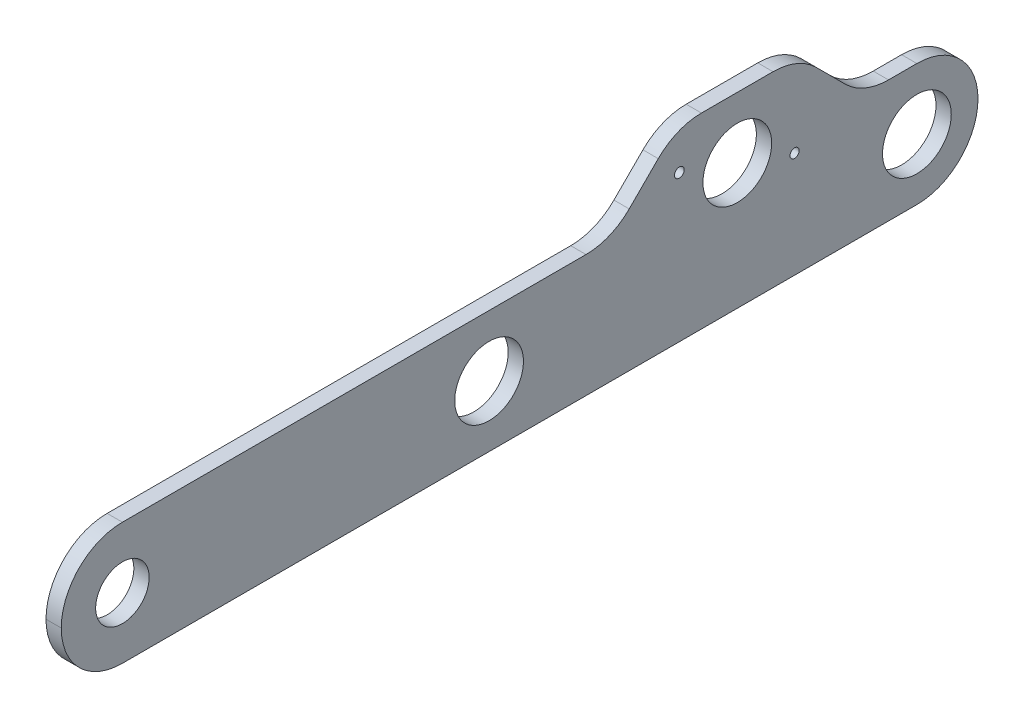
ISO-10303-21;
HEADER;
FILE_DESCRIPTION(('STEP AP214'),'2;1');
FILE_NAME('part.step','',(''),(''),'','','');
FILE_SCHEMA(('AUTOMOTIVE_DESIGN { 1 0 10303 214 1 1 1 1 }'));
ENDSEC;
DATA;
#1=APPLICATION_CONTEXT('core data for automotive mechanical design processes');
#2=APPLICATION_PROTOCOL_DEFINITION('international standard','automotive_design',2000,#1);
#3=PRODUCT_CONTEXT('',#1,'mechanical');
#4=PRODUCT('Part','Part','',(#3));
#5=PRODUCT_RELATED_PRODUCT_CATEGORY('part','',(#4));
#6=PRODUCT_DEFINITION_FORMATION('','',#4);
#7=PRODUCT_DEFINITION_CONTEXT('part definition',#1,'design');
#8=PRODUCT_DEFINITION('design','',#6,#7);
#9=PRODUCT_DEFINITION_SHAPE('','',#8);
#10=(LENGTH_UNIT() NAMED_UNIT(*) SI_UNIT(.MILLI.,.METRE.));
#11=(NAMED_UNIT(*) PLANE_ANGLE_UNIT() SI_UNIT($,.RADIAN.));
#12=(NAMED_UNIT(*) SI_UNIT($,.STERADIAN.) SOLID_ANGLE_UNIT());
#13=UNCERTAINTY_MEASURE_WITH_UNIT(LENGTH_MEASURE(1.E-05),#10,'distance_accuracy_value','');
#14=(GEOMETRIC_REPRESENTATION_CONTEXT(3) GLOBAL_UNCERTAINTY_ASSIGNED_CONTEXT((#13)) GLOBAL_UNIT_ASSIGNED_CONTEXT((#10,
#11,#12)) REPRESENTATION_CONTEXT('',''));
#15=CARTESIAN_POINT('',(0.,0.,0.));
#16=DIRECTION('',(0.,0.,1.));
#17=DIRECTION('',(1.,0.,0.));
#18=AXIS2_PLACEMENT_3D('',#15,#16,#17);
#19=CARTESIAN_POINT('',(6.35,0.,0.));
#20=DIRECTION('',(-1.,0.,0.));
#21=DIRECTION('',(0.,0.,1.));
#22=AXIS2_PLACEMENT_3D('',#19,#20,#21);
#23=PLANE('',#22);
#24=DIRECTION('',(0.,0.707106781186547,0.707106781186548));
#25=VECTOR('',#24,1.);
#26=CARTESIAN_POINT('',(6.35,77.7407683632074,-306.340768363207));
#27=LINE('',#26,#25);
#28=CARTESIAN_POINT('',(6.35,58.2394877578616,-325.842048968553));
#29=VERTEX_POINT('',#28);
#30=CARTESIAN_POINT('',(6.35,70.3012806053457,-313.780256121069));
#31=VERTEX_POINT('',#30);
#32=EDGE_CURVE('E349',#29,#31,#27,.T.);
#33=ORIENTED_EDGE('',*,*,#32,.T.);
#34=CARTESIAN_POINT('',(6.35,52.3407683632074,-295.819743878931));
#35=DIRECTION('',(-1.,0.,0.));
#36=DIRECTION('',(0.,0.,1.));
#37=AXIS2_PLACEMENT_3D('',#34,#35,#36);
#38=CIRCLE('',#37,25.4);
#39=CARTESIAN_POINT('',(6.35,77.7407683632074,-295.819743878931));
#40=VERTEX_POINT('',#39);
#41=EDGE_CURVE('E209',#31,#40,#38,.F.);
#42=ORIENTED_EDGE('',*,*,#41,.T.);
#43=DIRECTION('',(0.,0.,1.));
#44=VECTOR('',#43,1.);
#45=CARTESIAN_POINT('',(6.35,77.7407683632074,-255.540768363207));
#46=LINE('',#45,#44);
#47=CARTESIAN_POINT('',(6.35,77.7407683632074,-266.061792847484));
#48=VERTEX_POINT('',#47);
#49=EDGE_CURVE('E237',#40,#48,#46,.T.);
#50=ORIENTED_EDGE('',*,*,#49,.T.);
#51=CARTESIAN_POINT('',(6.35,52.3407683632074,-266.061792847484));
#52=DIRECTION('',(-1.,0.,0.));
#53=DIRECTION('',(0.,0.,1.));
#54=AXIS2_PLACEMENT_3D('',#51,#52,#53);
#55=CIRCLE('',#54,25.4);
#56=CARTESIAN_POINT('',(6.35,70.3012806053458,-248.101280605346));
#57=VERTEX_POINT('',#56);
#58=EDGE_CURVE('E207',#48,#57,#55,.F.);
#59=ORIENTED_EDGE('',*,*,#58,.T.);
#60=DIRECTION('',(0.,-0.707106781186547,0.707106781186548));
#61=VECTOR('',#60,1.);
#62=CARTESIAN_POINT('',(6.35,50.8,-228.6));
#63=LINE('',#62,#61);
#64=CARTESIAN_POINT('',(6.35,58.2394877578617,-236.039487757862));
#65=VERTEX_POINT('',#64);
#66=EDGE_CURVE('E235',#57,#65,#63,.T.);
#67=ORIENTED_EDGE('',*,*,#66,.T.);
#68=CARTESIAN_POINT('',(6.35,76.2,-218.078975515723));
#69=DIRECTION('',(-1.,0.,0.));
#70=DIRECTION('',(0.,0.,1.));
#71=AXIS2_PLACEMENT_3D('',#68,#69,#70);
#72=CIRCLE('',#71,25.4);
#73=CARTESIAN_POINT('',(6.35,50.8,-218.078975515723));
#74=VERTEX_POINT('',#73);
#75=EDGE_CURVE('E145',#65,#74,#72,.T.);
#76=ORIENTED_EDGE('',*,*,#75,.T.);
#77=DIRECTION('',(0.,0.,1.));
#78=VECTOR('',#77,1.);
#79=CARTESIAN_POINT('',(6.35,50.8,0.));
#80=LINE('',#79,#78);
#81=CARTESIAN_POINT('',(6.35,50.8,-25.4));
#82=VERTEX_POINT('',#81);
#83=EDGE_CURVE('E154',#74,#82,#80,.T.);
#84=ORIENTED_EDGE('',*,*,#83,.T.);
#85=CARTESIAN_POINT('',(6.35,25.4,-25.4));
#86=DIRECTION('',(-1.,0.,0.));
#87=DIRECTION('',(0.,0.,1.));
#88=AXIS2_PLACEMENT_3D('',#85,#86,#87);
#89=CIRCLE('',#88,25.4);
#90=CARTESIAN_POINT('',(6.35,25.4,0.));
#91=VERTEX_POINT('',#90);
#92=EDGE_CURVE('E50',#82,#91,#89,.F.);
#93=ORIENTED_EDGE('',*,*,#92,.T.);
#94=CARTESIAN_POINT('',(6.35,25.4,-25.4));
#95=DIRECTION('',(-1.,0.,0.));
#96=DIRECTION('',(0.,0.,1.));
#97=AXIS2_PLACEMENT_3D('',#94,#95,#96);
#98=CIRCLE('',#97,25.4);
#99=CARTESIAN_POINT('',(6.35,0.,-25.4));
#100=VERTEX_POINT('',#99);
#101=EDGE_CURVE('E202',#91,#100,#98,.F.);
#102=ORIENTED_EDGE('',*,*,#101,.T.);
#103=DIRECTION('',(0.,0.,-1.));
#104=VECTOR('',#103,1.);
#105=CARTESIAN_POINT('',(6.35,0.,-381.));
#106=LINE('',#105,#104);
#107=CARTESIAN_POINT('',(6.35,0.,-355.6));
#108=VERTEX_POINT('',#107);
#109=EDGE_CURVE('E163',#100,#108,#106,.T.);
#110=ORIENTED_EDGE('',*,*,#109,.T.);
#111=CARTESIAN_POINT('',(6.35,25.4,-355.6));
#112=DIRECTION('',(-1.,0.,0.));
#113=DIRECTION('',(0.,0.,1.));
#114=AXIS2_PLACEMENT_3D('',#111,#112,#113);
#115=CIRCLE('',#114,25.4);
#116=CARTESIAN_POINT('',(6.35,25.4,-381.));
#117=VERTEX_POINT('',#116);
#118=EDGE_CURVE('E57',#108,#117,#115,.F.);
#119=ORIENTED_EDGE('',*,*,#118,.T.);
#120=CARTESIAN_POINT('',(6.35,25.4,-355.6));
#121=DIRECTION('',(-1.,0.,0.));
#122=DIRECTION('',(0.,0.,1.));
#123=AXIS2_PLACEMENT_3D('',#120,#121,#122);
#124=CIRCLE('',#123,25.4);
#125=CARTESIAN_POINT('',(6.35,50.8,-355.6));
#126=VERTEX_POINT('',#125);
#127=EDGE_CURVE('E204',#117,#126,#124,.F.);
#128=ORIENTED_EDGE('',*,*,#127,.T.);
#129=DIRECTION('',(0.,0.,1.));
#130=VECTOR('',#129,1.);
#131=CARTESIAN_POINT('',(6.35,50.8,-333.281536726415));
#132=LINE('',#131,#130);
#133=CARTESIAN_POINT('',(6.35,50.8,-343.802561210692));
#134=VERTEX_POINT('',#133);
#135=EDGE_CURVE('E166',#126,#134,#132,.T.);
#136=ORIENTED_EDGE('',*,*,#135,.T.);
#137=CARTESIAN_POINT('',(6.35,76.2,-343.802561210692));
#138=DIRECTION('',(-1.,0.,0.));
#139=DIRECTION('',(0.,0.,1.));
#140=AXIS2_PLACEMENT_3D('',#137,#138,#139);
#141=CIRCLE('',#140,25.4);
#142=EDGE_CURVE('E11',#134,#29,#141,.T.);
#143=ORIENTED_EDGE('',*,*,#142,.T.);
#144=EDGE_LOOP('',(#33,#42,#50,#59,#67,#76,#84,#93,#102,#110,#119,#128,#136,#143));
#145=FACE_BOUND('',#144,.T.);
#146=CARTESIAN_POINT('',(6.35,25.4,-25.4));
#147=DIRECTION('',(1.,0.,0.));
#148=DIRECTION('',(0.,0.,-1.));
#149=AXIS2_PLACEMENT_3D('',#146,#147,#148);
#150=CIRCLE('',#149,11.1125);
#151=CARTESIAN_POINT('',(6.35,25.4,-36.5125));
#152=VERTEX_POINT('',#151);
#153=EDGE_CURVE('E245',#152,#152,#150,.T.);
#154=ORIENTED_EDGE('',*,*,#153,.F.);
#155=EDGE_LOOP('',(#154));
#156=FACE_BOUND('',#155,.T.);
#157=CARTESIAN_POINT('',(6.35,25.4,-355.6));
#158=DIRECTION('',(1.,0.,0.));
#159=DIRECTION('',(0.,0.,-1.));
#160=AXIS2_PLACEMENT_3D('',#157,#158,#159);
#161=CIRCLE('',#160,14.2875);
#162=CARTESIAN_POINT('',(6.35,25.4,-369.8875));
#163=VERTEX_POINT('',#162);
#164=EDGE_CURVE('E337',#163,#163,#161,.T.);
#165=ORIENTED_EDGE('',*,*,#164,.F.);
#166=EDGE_LOOP('',(#165));
#167=FACE_BOUND('',#166,.T.);
#168=CARTESIAN_POINT('',(6.35,25.4,-177.8));
#169=DIRECTION('',(1.,0.,0.));
#170=DIRECTION('',(0.,0.,-1.));
#171=AXIS2_PLACEMENT_3D('',#168,#169,#170);
#172=CIRCLE('',#171,14.2875);
#173=CARTESIAN_POINT('',(6.35,25.4,-192.0875));
#174=VERTEX_POINT('',#173);
#175=EDGE_CURVE('E331',#174,#174,#172,.T.);
#176=ORIENTED_EDGE('',*,*,#175,.F.);
#177=EDGE_LOOP('',(#176));
#178=FACE_BOUND('',#177,.T.);
#179=CARTESIAN_POINT('',(6.35,52.3407683632074,-280.957536726415));
#180=DIRECTION('',(1.,0.,0.));
#181=DIRECTION('',(0.,0.,-1.));
#182=AXIS2_PLACEMENT_3D('',#179,#180,#181);
#183=CIRCLE('',#182,14.2875);
#184=CARTESIAN_POINT('',(6.35,52.3407683632074,-295.245036726415));
#185=VERTEX_POINT('',#184);
#186=EDGE_CURVE('E325',#185,#185,#183,.T.);
#187=ORIENTED_EDGE('',*,*,#186,.F.);
#188=EDGE_LOOP('',(#187));
#189=FACE_BOUND('',#188,.T.);
#190=CARTESIAN_POINT('',(6.35,43.9556770327193,-304.76298599586));
#191=DIRECTION('',(1.,0.,0.));
#192=DIRECTION('',(0.,0.,-1.));
#193=AXIS2_PLACEMENT_3D('',#190,#191,#192);
#194=CIRCLE('',#193,1.9034759629624);
#195=CARTESIAN_POINT('',(6.35,43.9556770327193,-306.666461958822));
#196=VERTEX_POINT('',#195);
#197=EDGE_CURVE('E319',#196,#196,#194,.T.);
#198=ORIENTED_EDGE('',*,*,#197,.F.);
#199=EDGE_LOOP('',(#198));
#200=FACE_BOUND('',#199,.T.);
#201=CARTESIAN_POINT('',(6.35,60.9130654817949,-256.876798248377));
#202=DIRECTION('',(1.,0.,0.));
#203=DIRECTION('',(0.,0.,-1.));
#204=AXIS2_PLACEMENT_3D('',#201,#202,#203);
#205=CIRCLE('',#204,2.01929999999998);
#206=CARTESIAN_POINT('',(6.35,60.9130654817949,-258.896098248377));
#207=VERTEX_POINT('',#206);
#208=EDGE_CURVE('E224',#207,#207,#205,.T.);
#209=ORIENTED_EDGE('',*,*,#208,.F.);
#210=EDGE_LOOP('',(#209));
#211=FACE_BOUND('',#210,.T.);
#212=ADVANCED_FACE('F33',(#145,#156,#167,#178,#189,#200,#211),#23,.F.);
#213=CARTESIAN_POINT('',(0.,0.,0.));
#214=DIRECTION('',(-1.,0.,0.));
#215=DIRECTION('',(0.,0.,1.));
#216=AXIS2_PLACEMENT_3D('',#213,#214,#215);
#217=PLANE('',#216);
#218=CARTESIAN_POINT('',(0.,43.9556770327193,-304.76298599586));
#219=DIRECTION('',(1.,0.,0.));
#220=DIRECTION('',(0.,0.,-1.));
#221=AXIS2_PLACEMENT_3D('',#218,#219,#220);
#222=CIRCLE('',#221,1.9034759629624);
#223=CARTESIAN_POINT('',(0.,43.9556770327193,-306.666461958822));
#224=VERTEX_POINT('',#223);
#225=EDGE_CURVE('E316',#224,#224,#222,.T.);
#226=ORIENTED_EDGE('',*,*,#225,.T.);
#227=EDGE_LOOP('',(#226));
#228=FACE_BOUND('',#227,.T.);
#229=CARTESIAN_POINT('',(0.,25.4,-177.8));
#230=DIRECTION('',(1.,0.,0.));
#231=DIRECTION('',(0.,0.,-1.));
#232=AXIS2_PLACEMENT_3D('',#229,#230,#231);
#233=CIRCLE('',#232,14.2875);
#234=CARTESIAN_POINT('',(0.,25.4,-192.0875));
#235=VERTEX_POINT('',#234);
#236=EDGE_CURVE('E328',#235,#235,#233,.T.);
#237=ORIENTED_EDGE('',*,*,#236,.T.);
#238=EDGE_LOOP('',(#237));
#239=FACE_BOUND('',#238,.T.);
#240=CARTESIAN_POINT('',(0.,25.4,-25.4));
#241=DIRECTION('',(1.,0.,0.));
#242=DIRECTION('',(0.,0.,-1.));
#243=AXIS2_PLACEMENT_3D('',#240,#241,#242);
#244=CIRCLE('',#243,11.1125);
#245=CARTESIAN_POINT('',(0.,25.4,-36.5125));
#246=VERTEX_POINT('',#245);
#247=EDGE_CURVE('E340',#246,#246,#244,.T.);
#248=ORIENTED_EDGE('',*,*,#247,.T.);
#249=EDGE_LOOP('',(#248));
#250=FACE_BOUND('',#249,.T.);
#251=DIRECTION('',(0.,0.,1.));
#252=VECTOR('',#251,1.);
#253=CARTESIAN_POINT('',(0.,77.7407683632074,-255.540768363207));
#254=LINE('',#253,#252);
#255=CARTESIAN_POINT('',(0.,77.7407683632074,-295.819743878931));
#256=VERTEX_POINT('',#255);
#257=CARTESIAN_POINT('',(0.,77.7407683632074,-266.061792847484));
#258=VERTEX_POINT('',#257);
#259=EDGE_CURVE('E168',#256,#258,#254,.T.);
#260=ORIENTED_EDGE('',*,*,#259,.F.);
#261=CARTESIAN_POINT('',(0.,52.3407683632074,-295.819743878931));
#262=DIRECTION('',(-1.,0.,0.));
#263=DIRECTION('',(0.,0.,1.));
#264=AXIS2_PLACEMENT_3D('',#261,#262,#263);
#265=CIRCLE('',#264,25.4);
#266=CARTESIAN_POINT('',(0.,70.3012806053457,-313.780256121069));
#267=VERTEX_POINT('',#266);
#268=EDGE_CURVE('E199',#256,#267,#265,.T.);
#269=ORIENTED_EDGE('',*,*,#268,.T.);
#270=DIRECTION('',(0.,0.707106781186547,0.707106781186548));
#271=VECTOR('',#270,1.);
#272=CARTESIAN_POINT('',(0.,77.7407683632074,-306.340768363207));
#273=LINE('',#272,#271);
#274=CARTESIAN_POINT('',(0.,58.2394877578616,-325.842048968553));
#275=VERTEX_POINT('',#274);
#276=EDGE_CURVE('E248',#275,#267,#273,.T.);
#277=ORIENTED_EDGE('',*,*,#276,.F.);
#278=CARTESIAN_POINT('',(0.,76.2,-343.802561210692));
#279=DIRECTION('',(-1.,0.,0.));
#280=DIRECTION('',(0.,0.,1.));
#281=AXIS2_PLACEMENT_3D('',#278,#279,#280);
#282=CIRCLE('',#281,25.4);
#283=CARTESIAN_POINT('',(0.,50.8,-343.802561210692));
#284=VERTEX_POINT('',#283);
#285=EDGE_CURVE('E42',#275,#284,#282,.F.);
#286=ORIENTED_EDGE('',*,*,#285,.T.);
#287=DIRECTION('',(0.,0.,1.));
#288=VECTOR('',#287,1.);
#289=CARTESIAN_POINT('',(0.,50.8,-333.281536726415));
#290=LINE('',#289,#288);
#291=CARTESIAN_POINT('',(0.,50.8,-355.6));
#292=VERTEX_POINT('',#291);
#293=EDGE_CURVE('E244',#292,#284,#290,.T.);
#294=ORIENTED_EDGE('',*,*,#293,.F.);
#295=CARTESIAN_POINT('',(0.,25.4,-355.6));
#296=DIRECTION('',(-1.,0.,0.));
#297=DIRECTION('',(0.,0.,1.));
#298=AXIS2_PLACEMENT_3D('',#295,#296,#297);
#299=CIRCLE('',#298,25.4);
#300=CARTESIAN_POINT('',(0.,25.4,-381.));
#301=VERTEX_POINT('',#300);
#302=EDGE_CURVE('E193',#292,#301,#299,.T.);
#303=ORIENTED_EDGE('',*,*,#302,.T.);
#304=CARTESIAN_POINT('',(0.,25.4,-355.6));
#305=DIRECTION('',(-1.,0.,0.));
#306=DIRECTION('',(0.,0.,1.));
#307=AXIS2_PLACEMENT_3D('',#304,#305,#306);
#308=CIRCLE('',#307,25.4);
#309=CARTESIAN_POINT('',(0.,0.,-355.6));
#310=VERTEX_POINT('',#309);
#311=EDGE_CURVE('E195',#301,#310,#308,.T.);
#312=ORIENTED_EDGE('',*,*,#311,.T.);
#313=DIRECTION('',(0.,0.,-1.));
#314=VECTOR('',#313,1.);
#315=CARTESIAN_POINT('',(0.,0.,-381.));
#316=LINE('',#315,#314);
#317=CARTESIAN_POINT('',(0.,0.,-25.4));
#318=VERTEX_POINT('',#317);
#319=EDGE_CURVE('E241',#318,#310,#316,.T.);
#320=ORIENTED_EDGE('',*,*,#319,.F.);
#321=CARTESIAN_POINT('',(0.,25.4,-25.4));
#322=DIRECTION('',(-1.,0.,0.));
#323=DIRECTION('',(0.,0.,1.));
#324=AXIS2_PLACEMENT_3D('',#321,#322,#323);
#325=CIRCLE('',#324,25.4);
#326=CARTESIAN_POINT('',(0.,25.4,0.));
#327=VERTEX_POINT('',#326);
#328=EDGE_CURVE('E191',#318,#327,#325,.T.);
#329=ORIENTED_EDGE('',*,*,#328,.T.);
#330=CARTESIAN_POINT('',(0.,25.4,-25.4));
#331=DIRECTION('',(-1.,0.,0.));
#332=DIRECTION('',(0.,0.,1.));
#333=AXIS2_PLACEMENT_3D('',#330,#331,#332);
#334=CIRCLE('',#333,25.4);
#335=CARTESIAN_POINT('',(0.,50.8,-25.4));
#336=VERTEX_POINT('',#335);
#337=EDGE_CURVE('E162',#327,#336,#334,.T.);
#338=ORIENTED_EDGE('',*,*,#337,.T.);
#339=DIRECTION('',(0.,0.,1.));
#340=VECTOR('',#339,1.);
#341=CARTESIAN_POINT('',(0.,50.8,0.));
#342=LINE('',#341,#340);
#343=CARTESIAN_POINT('',(0.,50.8,-218.078975515723));
#344=VERTEX_POINT('',#343);
#345=EDGE_CURVE('E152',#344,#336,#342,.T.);
#346=ORIENTED_EDGE('',*,*,#345,.F.);
#347=CARTESIAN_POINT('',(0.,76.2,-218.078975515723));
#348=DIRECTION('',(-1.,0.,0.));
#349=DIRECTION('',(0.,0.,1.));
#350=AXIS2_PLACEMENT_3D('',#347,#348,#349);
#351=CIRCLE('',#350,25.4);
#352=CARTESIAN_POINT('',(0.,58.2394877578617,-236.039487757862));
#353=VERTEX_POINT('',#352);
#354=EDGE_CURVE('E135',#344,#353,#351,.F.);
#355=ORIENTED_EDGE('',*,*,#354,.T.);
#356=DIRECTION('',(0.,-0.707106781186547,0.707106781186548));
#357=VECTOR('',#356,1.);
#358=CARTESIAN_POINT('',(0.,50.8,-228.6));
#359=LINE('',#358,#357);
#360=CARTESIAN_POINT('',(0.,70.3012806053458,-248.101280605346));
#361=VERTEX_POINT('',#360);
#362=EDGE_CURVE('E164',#361,#353,#359,.T.);
#363=ORIENTED_EDGE('',*,*,#362,.F.);
#364=CARTESIAN_POINT('',(0.,52.3407683632074,-266.061792847484));
#365=DIRECTION('',(-1.,0.,0.));
#366=DIRECTION('',(0.,0.,1.));
#367=AXIS2_PLACEMENT_3D('',#364,#365,#366);
#368=CIRCLE('',#367,25.4);
#369=EDGE_CURVE('E197',#361,#258,#368,.T.);
#370=ORIENTED_EDGE('',*,*,#369,.T.);
#371=EDGE_LOOP('',(#260,#269,#277,#286,#294,#303,#312,#320,#329,#338,#346,#355,#363,#370));
#372=FACE_BOUND('',#371,.T.);
#373=CARTESIAN_POINT('',(0.,25.4,-355.6));
#374=DIRECTION('',(1.,0.,0.));
#375=DIRECTION('',(0.,0.,-1.));
#376=AXIS2_PLACEMENT_3D('',#373,#374,#375);
#377=CIRCLE('',#376,14.2875);
#378=CARTESIAN_POINT('',(0.,25.4,-369.8875));
#379=VERTEX_POINT('',#378);
#380=EDGE_CURVE('E334',#379,#379,#377,.T.);
#381=ORIENTED_EDGE('',*,*,#380,.T.);
#382=EDGE_LOOP('',(#381));
#383=FACE_BOUND('',#382,.T.);
#384=CARTESIAN_POINT('',(0.,52.3407683632074,-280.957536726415));
#385=DIRECTION('',(1.,0.,0.));
#386=DIRECTION('',(0.,0.,-1.));
#387=AXIS2_PLACEMENT_3D('',#384,#385,#386);
#388=CIRCLE('',#387,14.2875);
#389=CARTESIAN_POINT('',(0.,52.3407683632074,-295.245036726415));
#390=VERTEX_POINT('',#389);
#391=EDGE_CURVE('E323',#390,#390,#388,.T.);
#392=ORIENTED_EDGE('',*,*,#391,.T.);
#393=EDGE_LOOP('',(#392));
#394=FACE_BOUND('',#393,.T.);
#395=CARTESIAN_POINT('',(0.,60.9130654817949,-256.876798248377));
#396=DIRECTION('',(1.,0.,0.));
#397=DIRECTION('',(0.,0.,-1.));
#398=AXIS2_PLACEMENT_3D('',#395,#396,#397);
#399=CIRCLE('',#398,2.01929999999998);
#400=CARTESIAN_POINT('',(0.,60.9130654817949,-258.896098248377));
#401=VERTEX_POINT('',#400);
#402=EDGE_CURVE('E219',#401,#401,#399,.T.);
#403=ORIENTED_EDGE('',*,*,#402,.T.);
#404=EDGE_LOOP('',(#403));
#405=FACE_BOUND('',#404,.T.);
#406=ADVANCED_FACE('F159',(#228,#239,#250,#372,#383,#394,#405),#217,.T.);
#407=CARTESIAN_POINT('',(6.35,0.,-381.));
#408=DIRECTION('',(0.,1.,0.));
#409=DIRECTION('',(0.,0.,1.));
#410=AXIS2_PLACEMENT_3D('',#407,#408,#409);
#411=PLANE('',#410);
#412=ORIENTED_EDGE('',*,*,#319,.T.);
#413=DIRECTION('',(-1.,0.,0.));
#414=VECTOR('',#413,1.);
#415=CARTESIAN_POINT('',(6.35,0.,-355.6));
#416=LINE('',#415,#414);
#417=EDGE_CURVE('E146',#310,#108,#416,.F.);
#418=ORIENTED_EDGE('',*,*,#417,.T.);
#419=ORIENTED_EDGE('',*,*,#109,.F.);
#420=DIRECTION('',(-1.,0.,0.));
#421=VECTOR('',#420,1.);
#422=CARTESIAN_POINT('',(6.35,0.,-25.4));
#423=LINE('',#422,#421);
#424=EDGE_CURVE('E211',#100,#318,#423,.T.);
#425=ORIENTED_EDGE('',*,*,#424,.T.);
#426=EDGE_LOOP('',(#412,#418,#419,#425));
#427=FACE_BOUND('',#426,.T.);
#428=ADVANCED_FACE('F279',(#427),#411,.F.);
#429=CARTESIAN_POINT('',(6.35,50.8,-333.281536726415));
#430=DIRECTION('',(0.,-1.,0.));
#431=DIRECTION('',(0.,0.,-1.));
#432=AXIS2_PLACEMENT_3D('',#429,#430,#431);
#433=PLANE('',#432);
#434=ORIENTED_EDGE('',*,*,#293,.T.);
#435=DIRECTION('',(-1.,0.,0.));
#436=VECTOR('',#435,1.);
#437=CARTESIAN_POINT('',(6.35,50.8,-343.802561210692));
#438=LINE('',#437,#436);
#439=EDGE_CURVE('E183',#284,#134,#438,.F.);
#440=ORIENTED_EDGE('',*,*,#439,.T.);
#441=ORIENTED_EDGE('',*,*,#135,.F.);
#442=DIRECTION('',(-1.,0.,0.));
#443=VECTOR('',#442,1.);
#444=CARTESIAN_POINT('',(6.35,50.8,-355.6));
#445=LINE('',#444,#443);
#446=EDGE_CURVE('E181',#126,#292,#445,.T.);
#447=ORIENTED_EDGE('',*,*,#446,.T.);
#448=EDGE_LOOP('',(#434,#440,#441,#447));
#449=FACE_BOUND('',#448,.T.);
#450=ADVANCED_FACE('F364',(#449),#433,.F.);
#451=CARTESIAN_POINT('',(6.35,77.7407683632074,-306.340768363207));
#452=DIRECTION('',(0.,-0.707106781186548,0.707106781186547));
#453=DIRECTION('',(0.,-0.707106781186547,-0.707106781186548));
#454=AXIS2_PLACEMENT_3D('',#451,#452,#453);
#455=PLANE('',#454);
#456=ORIENTED_EDGE('',*,*,#32,.F.);
#457=DIRECTION('',(-1.,0.,0.));
#458=VECTOR('',#457,1.);
#459=CARTESIAN_POINT('',(0.,58.2394877578617,-325.842048968553));
#460=LINE('',#459,#458);
#461=EDGE_CURVE('E178',#29,#275,#460,.T.);
#462=ORIENTED_EDGE('',*,*,#461,.T.);
#463=ORIENTED_EDGE('',*,*,#276,.T.);
#464=DIRECTION('',(-1.,0.,0.));
#465=VECTOR('',#464,1.);
#466=CARTESIAN_POINT('',(6.35,70.3012806053457,-313.780256121069));
#467=LINE('',#466,#465);
#468=EDGE_CURVE('E176',#267,#31,#467,.F.);
#469=ORIENTED_EDGE('',*,*,#468,.T.);
#470=EDGE_LOOP('',(#456,#462,#463,#469));
#471=FACE_BOUND('',#470,.T.);
#472=ADVANCED_FACE('F272',(#471),#455,.F.);
#473=CARTESIAN_POINT('',(6.35,77.7407683632074,-255.540768363207));
#474=DIRECTION('',(0.,-1.,0.));
#475=DIRECTION('',(0.,0.,-1.));
#476=AXIS2_PLACEMENT_3D('',#473,#474,#475);
#477=PLANE('',#476);
#478=ORIENTED_EDGE('',*,*,#49,.F.);
#479=DIRECTION('',(-1.,0.,0.));
#480=VECTOR('',#479,1.);
#481=CARTESIAN_POINT('',(6.35,77.7407683632074,-295.819743878931));
#482=LINE('',#481,#480);
#483=EDGE_CURVE('E187',#40,#256,#482,.T.);
#484=ORIENTED_EDGE('',*,*,#483,.T.);
#485=ORIENTED_EDGE('',*,*,#259,.T.);
#486=DIRECTION('',(-1.,0.,0.));
#487=VECTOR('',#486,1.);
#488=CARTESIAN_POINT('',(6.35,77.7407683632074,-266.061792847484));
#489=LINE('',#488,#487);
#490=EDGE_CURVE('E185',#258,#48,#489,.F.);
#491=ORIENTED_EDGE('',*,*,#490,.T.);
#492=EDGE_LOOP('',(#478,#484,#485,#491));
#493=FACE_BOUND('',#492,.T.);
#494=ADVANCED_FACE('F254',(#493),#477,.F.);
#495=CARTESIAN_POINT('',(6.35,50.8,-228.6));
#496=DIRECTION('',(0.,-0.707106781186548,-0.707106781186547));
#497=DIRECTION('',(0.,0.707106781186547,-0.707106781186548));
#498=AXIS2_PLACEMENT_3D('',#495,#496,#497);
#499=PLANE('',#498);
#500=ORIENTED_EDGE('',*,*,#362,.T.);
#501=DIRECTION('',(-1.,0.,0.));
#502=VECTOR('',#501,1.);
#503=CARTESIAN_POINT('',(6.35,58.2394877578617,-236.039487757862));
#504=LINE('',#503,#502);
#505=EDGE_CURVE('E140',#353,#65,#504,.F.);
#506=ORIENTED_EDGE('',*,*,#505,.T.);
#507=ORIENTED_EDGE('',*,*,#66,.F.);
#508=DIRECTION('',(-1.,0.,0.));
#509=VECTOR('',#508,1.);
#510=CARTESIAN_POINT('',(6.35,70.3012806053458,-248.101280605346));
#511=LINE('',#510,#509);
#512=EDGE_CURVE('E155',#57,#361,#511,.T.);
#513=ORIENTED_EDGE('',*,*,#512,.T.);
#514=EDGE_LOOP('',(#500,#506,#507,#513));
#515=FACE_BOUND('',#514,.T.);
#516=ADVANCED_FACE('F263',(#515),#499,.F.);
#517=CARTESIAN_POINT('',(6.35,50.8,0.));
#518=DIRECTION('',(0.,-1.,0.));
#519=DIRECTION('',(0.,0.,-1.));
#520=AXIS2_PLACEMENT_3D('',#517,#518,#519);
#521=PLANE('',#520);
#522=ORIENTED_EDGE('',*,*,#83,.F.);
#523=DIRECTION('',(-1.,0.,0.));
#524=VECTOR('',#523,1.);
#525=CARTESIAN_POINT('',(0.,50.8,-218.078975515723));
#526=LINE('',#525,#524);
#527=EDGE_CURVE('E139',#74,#344,#526,.T.);
#528=ORIENTED_EDGE('',*,*,#527,.T.);
#529=ORIENTED_EDGE('',*,*,#345,.T.);
#530=DIRECTION('',(-1.,0.,0.));
#531=VECTOR('',#530,1.);
#532=CARTESIAN_POINT('',(6.35,50.8,-25.4));
#533=LINE('',#532,#531);
#534=EDGE_CURVE('E156',#336,#82,#533,.F.);
#535=ORIENTED_EDGE('',*,*,#534,.T.);
#536=EDGE_LOOP('',(#522,#528,#529,#535));
#537=FACE_BOUND('',#536,.T.);
#538=ADVANCED_FACE('F151',(#537),#521,.F.);
#539=CARTESIAN_POINT('',(6.35,25.4,-25.4));
#540=DIRECTION('',(-1.,0.,0.));
#541=DIRECTION('',(0.,0.,1.));
#542=AXIS2_PLACEMENT_3D('',#539,#540,#541);
#543=CYLINDRICAL_SURFACE('',#542,11.1125);
#544=ORIENTED_EDGE('',*,*,#153,.T.);
#545=EDGE_LOOP('',(#544));
#546=FACE_BOUND('',#545,.T.);
#547=ORIENTED_EDGE('',*,*,#247,.F.);
#548=EDGE_LOOP('',(#547));
#549=FACE_BOUND('',#548,.T.);
#550=ADVANCED_FACE('F270',(#546,#549),#543,.F.);
#551=CARTESIAN_POINT('',(6.35,25.4,-355.6));
#552=DIRECTION('',(-1.,0.,0.));
#553=DIRECTION('',(0.,0.,1.));
#554=AXIS2_PLACEMENT_3D('',#551,#552,#553);
#555=CYLINDRICAL_SURFACE('',#554,14.2875);
#556=ORIENTED_EDGE('',*,*,#164,.T.);
#557=EDGE_LOOP('',(#556));
#558=FACE_BOUND('',#557,.T.);
#559=ORIENTED_EDGE('',*,*,#380,.F.);
#560=EDGE_LOOP('',(#559));
#561=FACE_BOUND('',#560,.T.);
#562=ADVANCED_FACE('F285',(#558,#561),#555,.F.);
#563=CARTESIAN_POINT('',(6.35,25.4,-177.8));
#564=DIRECTION('',(-1.,0.,0.));
#565=DIRECTION('',(0.,0.,1.));
#566=AXIS2_PLACEMENT_3D('',#563,#564,#565);
#567=CYLINDRICAL_SURFACE('',#566,14.2875);
#568=ORIENTED_EDGE('',*,*,#175,.T.);
#569=EDGE_LOOP('',(#568));
#570=FACE_BOUND('',#569,.T.);
#571=ORIENTED_EDGE('',*,*,#236,.F.);
#572=EDGE_LOOP('',(#571));
#573=FACE_BOUND('',#572,.T.);
#574=ADVANCED_FACE('F289',(#570,#573),#567,.F.);
#575=CARTESIAN_POINT('',(6.35,52.3407683632074,-280.957536726415));
#576=DIRECTION('',(-1.,0.,0.));
#577=DIRECTION('',(0.,0.,1.));
#578=AXIS2_PLACEMENT_3D('',#575,#576,#577);
#579=CYLINDRICAL_SURFACE('',#578,14.2875);
#580=ORIENTED_EDGE('',*,*,#186,.T.);
#581=EDGE_LOOP('',(#580));
#582=FACE_BOUND('',#581,.T.);
#583=ORIENTED_EDGE('',*,*,#391,.F.);
#584=EDGE_LOOP('',(#583));
#585=FACE_BOUND('',#584,.T.);
#586=ADVANCED_FACE('F293',(#582,#585),#579,.F.);
#587=CARTESIAN_POINT('',(6.35,43.9556770327193,-304.76298599586));
#588=DIRECTION('',(-1.,0.,0.));
#589=DIRECTION('',(0.,0.,1.));
#590=AXIS2_PLACEMENT_3D('',#587,#588,#589);
#591=CYLINDRICAL_SURFACE('',#590,1.9034759629624);
#592=ORIENTED_EDGE('',*,*,#197,.T.);
#593=EDGE_LOOP('',(#592));
#594=FACE_BOUND('',#593,.T.);
#595=ORIENTED_EDGE('',*,*,#225,.F.);
#596=EDGE_LOOP('',(#595));
#597=FACE_BOUND('',#596,.T.);
#598=ADVANCED_FACE('F297',(#594,#597),#591,.F.);
#599=CARTESIAN_POINT('',(6.35,60.9130654817949,-256.876798248377));
#600=DIRECTION('',(-1.,0.,0.));
#601=DIRECTION('',(0.,0.,1.));
#602=AXIS2_PLACEMENT_3D('',#599,#600,#601);
#603=CYLINDRICAL_SURFACE('',#602,2.01929999999998);
#604=ORIENTED_EDGE('',*,*,#208,.T.);
#605=EDGE_LOOP('',(#604));
#606=FACE_BOUND('',#605,.T.);
#607=ORIENTED_EDGE('',*,*,#402,.F.);
#608=EDGE_LOOP('',(#607));
#609=FACE_BOUND('',#608,.T.);
#610=ADVANCED_FACE('F301',(#606,#609),#603,.F.);
#611=CARTESIAN_POINT('',(6.35,76.2,-218.078975515723));
#612=DIRECTION('',(1.,0.,0.));
#613=DIRECTION('',(0.,0.,-1.));
#614=AXIS2_PLACEMENT_3D('',#611,#612,#613);
#615=CYLINDRICAL_SURFACE('',#614,25.4);
#616=ORIENTED_EDGE('',*,*,#75,.F.);
#617=ORIENTED_EDGE('',*,*,#505,.F.);
#618=ORIENTED_EDGE('',*,*,#354,.F.);
#619=ORIENTED_EDGE('',*,*,#527,.F.);
#620=EDGE_LOOP('',(#616,#617,#618,#619));
#621=FACE_BOUND('',#620,.T.);
#622=ADVANCED_FACE('F138',(#621),#615,.F.);
#623=CARTESIAN_POINT('',(6.35,76.2,-343.802561210692));
#624=DIRECTION('',(1.,0.,0.));
#625=DIRECTION('',(0.,0.,-1.));
#626=AXIS2_PLACEMENT_3D('',#623,#624,#625);
#627=CYLINDRICAL_SURFACE('',#626,25.4);
#628=ORIENTED_EDGE('',*,*,#142,.F.);
#629=ORIENTED_EDGE('',*,*,#439,.F.);
#630=ORIENTED_EDGE('',*,*,#285,.F.);
#631=ORIENTED_EDGE('',*,*,#461,.F.);
#632=EDGE_LOOP('',(#628,#629,#630,#631));
#633=FACE_BOUND('',#632,.T.);
#634=ADVANCED_FACE('F308',(#633),#627,.F.);
#635=CARTESIAN_POINT('',(6.35,52.3407683632074,-295.819743878931));
#636=DIRECTION('',(-1.,0.,0.));
#637=DIRECTION('',(0.,0.,1.));
#638=AXIS2_PLACEMENT_3D('',#635,#636,#637);
#639=CYLINDRICAL_SURFACE('',#638,25.4);
#640=ORIENTED_EDGE('',*,*,#41,.F.);
#641=ORIENTED_EDGE('',*,*,#468,.F.);
#642=ORIENTED_EDGE('',*,*,#268,.F.);
#643=ORIENTED_EDGE('',*,*,#483,.F.);
#644=EDGE_LOOP('',(#640,#641,#642,#643));
#645=FACE_BOUND('',#644,.T.);
#646=ADVANCED_FACE('F357',(#645),#639,.T.);
#647=CARTESIAN_POINT('',(6.35,52.3407683632074,-266.061792847484));
#648=DIRECTION('',(-1.,0.,0.));
#649=DIRECTION('',(0.,0.,1.));
#650=AXIS2_PLACEMENT_3D('',#647,#648,#649);
#651=CYLINDRICAL_SURFACE('',#650,25.4);
#652=ORIENTED_EDGE('',*,*,#58,.F.);
#653=ORIENTED_EDGE('',*,*,#490,.F.);
#654=ORIENTED_EDGE('',*,*,#369,.F.);
#655=ORIENTED_EDGE('',*,*,#512,.F.);
#656=EDGE_LOOP('',(#652,#653,#654,#655));
#657=FACE_BOUND('',#656,.T.);
#658=ADVANCED_FACE('F259',(#657),#651,.T.);
#659=CARTESIAN_POINT('',(6.35,25.4,-355.6));
#660=DIRECTION('',(-1.,0.,0.));
#661=DIRECTION('',(0.,0.,1.));
#662=AXIS2_PLACEMENT_3D('',#659,#660,#661);
#663=CYLINDRICAL_SURFACE('',#662,25.4);
#664=ORIENTED_EDGE('',*,*,#446,.F.);
#665=ORIENTED_EDGE('',*,*,#127,.F.);
#666=DIRECTION('',(-1.,0.,0.));
#667=VECTOR('',#666,1.);
#668=CARTESIAN_POINT('',(6.35,25.4,-381.));
#669=LINE('',#668,#667);
#670=EDGE_CURVE('E217',#301,#117,#669,.F.);
#671=ORIENTED_EDGE('',*,*,#670,.F.);
#672=ORIENTED_EDGE('',*,*,#302,.F.);
#673=EDGE_LOOP('',(#664,#665,#671,#672));
#674=FACE_BOUND('',#673,.T.);
#675=ADVANCED_FACE('F368',(#674),#663,.T.);
#676=CARTESIAN_POINT('',(6.35,25.4,-355.6));
#677=DIRECTION('',(-1.,0.,0.));
#678=DIRECTION('',(0.,0.,1.));
#679=AXIS2_PLACEMENT_3D('',#676,#677,#678);
#680=CYLINDRICAL_SURFACE('',#679,25.4);
#681=ORIENTED_EDGE('',*,*,#118,.F.);
#682=ORIENTED_EDGE('',*,*,#417,.F.);
#683=ORIENTED_EDGE('',*,*,#311,.F.);
#684=ORIENTED_EDGE('',*,*,#670,.T.);
#685=EDGE_LOOP('',(#681,#682,#683,#684));
#686=FACE_BOUND('',#685,.T.);
#687=ADVANCED_FACE('F373',(#686),#680,.T.);
#688=CARTESIAN_POINT('',(6.35,25.4,-25.4));
#689=DIRECTION('',(-1.,0.,0.));
#690=DIRECTION('',(0.,0.,1.));
#691=AXIS2_PLACEMENT_3D('',#688,#689,#690);
#692=CYLINDRICAL_SURFACE('',#691,25.4);
#693=DIRECTION('',(-1.,0.,0.));
#694=VECTOR('',#693,1.);
#695=CARTESIAN_POINT('',(6.35,25.4,0.));
#696=LINE('',#695,#694);
#697=EDGE_CURVE('E37',#91,#327,#696,.T.);
#698=ORIENTED_EDGE('',*,*,#697,.F.);
#699=ORIENTED_EDGE('',*,*,#92,.F.);
#700=ORIENTED_EDGE('',*,*,#534,.F.);
#701=ORIENTED_EDGE('',*,*,#337,.F.);
#702=EDGE_LOOP('',(#698,#699,#700,#701));
#703=FACE_BOUND('',#702,.T.);
#704=ADVANCED_FACE('F35',(#703),#692,.T.);
#705=CARTESIAN_POINT('',(6.35,25.4,-25.4));
#706=DIRECTION('',(-1.,0.,0.));
#707=DIRECTION('',(0.,0.,1.));
#708=AXIS2_PLACEMENT_3D('',#705,#706,#707);
#709=CYLINDRICAL_SURFACE('',#708,25.4);
#710=ORIENTED_EDGE('',*,*,#101,.F.);
#711=ORIENTED_EDGE('',*,*,#697,.T.);
#712=ORIENTED_EDGE('',*,*,#328,.F.);
#713=ORIENTED_EDGE('',*,*,#424,.F.);
#714=EDGE_LOOP('',(#710,#711,#712,#713));
#715=FACE_BOUND('',#714,.T.);
#716=ADVANCED_FACE('F229',(#715),#709,.T.);
#717=CLOSED_SHELL('',(#212,#406,#428,#450,#472,#494,#516,#538,#550,#562,#574,#586,#598,#610,
#622,#634,#646,#658,#675,#687,#704,#716));
#718=MANIFOLD_SOLID_BREP('B2',#717);
#719=ADVANCED_BREP_SHAPE_REPRESENTATION('',(#18,#718),#14);
#720=SHAPE_DEFINITION_REPRESENTATION(#9,#719);
ENDSEC;
END-ISO-10303-21;
